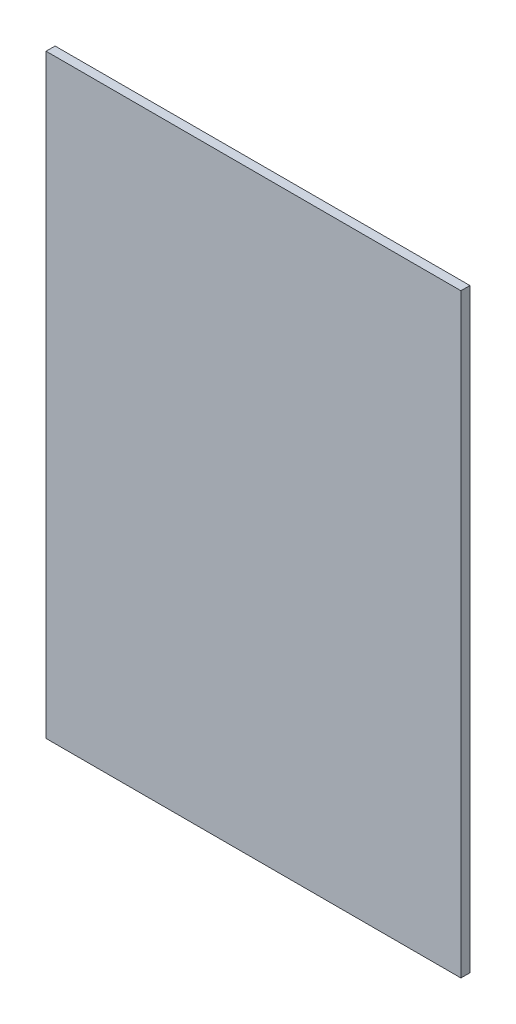
ISO-10303-21;
HEADER;
FILE_DESCRIPTION(('STEP AP214'),'2;1');
FILE_NAME('part.step','',(''),(''),'','','');
FILE_SCHEMA(('AUTOMOTIVE_DESIGN { 1 0 10303 214 1 1 1 1 }'));
ENDSEC;
DATA;
#1=APPLICATION_CONTEXT('core data for automotive mechanical design processes');
#2=APPLICATION_PROTOCOL_DEFINITION('international standard','automotive_design',2000,#1);
#3=PRODUCT_CONTEXT('',#1,'mechanical');
#4=PRODUCT('Part','Part','',(#3));
#5=PRODUCT_RELATED_PRODUCT_CATEGORY('part','',(#4));
#6=PRODUCT_DEFINITION_FORMATION('','',#4);
#7=PRODUCT_DEFINITION_CONTEXT('part definition',#1,'design');
#8=PRODUCT_DEFINITION('design','',#6,#7);
#9=PRODUCT_DEFINITION_SHAPE('','',#8);
#10=(LENGTH_UNIT() NAMED_UNIT(*) SI_UNIT(.MILLI.,.METRE.));
#11=(NAMED_UNIT(*) PLANE_ANGLE_UNIT() SI_UNIT($,.RADIAN.));
#12=(NAMED_UNIT(*) SI_UNIT($,.STERADIAN.) SOLID_ANGLE_UNIT());
#13=UNCERTAINTY_MEASURE_WITH_UNIT(LENGTH_MEASURE(1.E-05),#10,'distance_accuracy_value','');
#14=(GEOMETRIC_REPRESENTATION_CONTEXT(3) GLOBAL_UNCERTAINTY_ASSIGNED_CONTEXT((#13)) GLOBAL_UNIT_ASSIGNED_CONTEXT((#10,
#11,#12)) REPRESENTATION_CONTEXT('',''));
#15=CARTESIAN_POINT('',(0.,0.,0.));
#16=DIRECTION('',(0.,0.,1.));
#17=DIRECTION('',(1.,0.,0.));
#18=AXIS2_PLACEMENT_3D('',#15,#16,#17);
#19=CARTESIAN_POINT('',(-230.,-330.,10.));
#20=DIRECTION('',(1.,0.,0.));
#21=DIRECTION('',(0.,0.,-1.));
#22=AXIS2_PLACEMENT_3D('',#19,#20,#21);
#23=PLANE('',#22);
#24=DIRECTION('',(0.,-1.,0.));
#25=VECTOR('',#24,1.);
#26=CARTESIAN_POINT('',(-230.,-330.,0.));
#27=LINE('',#26,#25);
#28=CARTESIAN_POINT('',(-230.,330.,0.));
#29=VERTEX_POINT('',#28);
#30=CARTESIAN_POINT('',(-230.,-330.,0.));
#31=VERTEX_POINT('',#30);
#32=EDGE_CURVE('E129',#29,#31,#27,.T.);
#33=ORIENTED_EDGE('',*,*,#32,.T.);
#34=DIRECTION('',(0.,0.,-1.));
#35=VECTOR('',#34,1.);
#36=CARTESIAN_POINT('',(-230.,-330.,10.));
#37=LINE('',#36,#35);
#38=CARTESIAN_POINT('',(-230.,-330.,10.));
#39=VERTEX_POINT('',#38);
#40=EDGE_CURVE('E11',#39,#31,#37,.T.);
#41=ORIENTED_EDGE('',*,*,#40,.F.);
#42=DIRECTION('',(0.,-1.,0.));
#43=VECTOR('',#42,1.);
#44=CARTESIAN_POINT('',(-230.,-330.,10.));
#45=LINE('',#44,#43);
#46=CARTESIAN_POINT('',(-230.,330.,10.));
#47=VERTEX_POINT('',#46);
#48=EDGE_CURVE('E149',#47,#39,#45,.T.);
#49=ORIENTED_EDGE('',*,*,#48,.F.);
#50=DIRECTION('',(0.,0.,-1.));
#51=VECTOR('',#50,1.);
#52=CARTESIAN_POINT('',(-230.,330.,10.));
#53=LINE('',#52,#51);
#54=EDGE_CURVE('E154',#47,#29,#53,.T.);
#55=ORIENTED_EDGE('',*,*,#54,.T.);
#56=EDGE_LOOP('',(#33,#41,#49,#55));
#57=FACE_BOUND('',#56,.T.);
#58=ADVANCED_FACE('F33',(#57),#23,.F.);
#59=CARTESIAN_POINT('',(230.,-330.,10.));
#60=DIRECTION('',(0.,1.,0.));
#61=DIRECTION('',(0.,0.,1.));
#62=AXIS2_PLACEMENT_3D('',#59,#60,#61);
#63=PLANE('',#62);
#64=DIRECTION('',(1.,0.,0.));
#65=VECTOR('',#64,1.);
#66=CARTESIAN_POINT('',(230.,-330.,0.));
#67=LINE('',#66,#65);
#68=CARTESIAN_POINT('',(230.,-330.,0.));
#69=VERTEX_POINT('',#68);
#70=EDGE_CURVE('E133',#31,#69,#67,.T.);
#71=ORIENTED_EDGE('',*,*,#70,.T.);
#72=DIRECTION('',(0.,0.,-1.));
#73=VECTOR('',#72,1.);
#74=CARTESIAN_POINT('',(230.,-330.,10.));
#75=LINE('',#74,#73);
#76=CARTESIAN_POINT('',(230.,-330.,10.));
#77=VERTEX_POINT('',#76);
#78=EDGE_CURVE('E40',#77,#69,#75,.T.);
#79=ORIENTED_EDGE('',*,*,#78,.F.);
#80=DIRECTION('',(1.,0.,0.));
#81=VECTOR('',#80,1.);
#82=CARTESIAN_POINT('',(230.,-330.,10.));
#83=LINE('',#82,#81);
#84=EDGE_CURVE('E84',#39,#77,#83,.T.);
#85=ORIENTED_EDGE('',*,*,#84,.F.);
#86=ORIENTED_EDGE('',*,*,#40,.T.);
#87=EDGE_LOOP('',(#71,#79,#85,#86));
#88=FACE_BOUND('',#87,.T.);
#89=ADVANCED_FACE('F183',(#88),#63,.F.);
#90=CARTESIAN_POINT('',(230.,-330.,10.));
#91=DIRECTION('',(-1.,0.,0.));
#92=DIRECTION('',(0.,0.,1.));
#93=AXIS2_PLACEMENT_3D('',#90,#91,#92);
#94=PLANE('',#93);
#95=DIRECTION('',(0.,1.,0.));
#96=VECTOR('',#95,1.);
#97=CARTESIAN_POINT('',(230.,-330.,0.));
#98=LINE('',#97,#96);
#99=CARTESIAN_POINT('',(230.,330.,0.));
#100=VERTEX_POINT('',#99);
#101=EDGE_CURVE('E157',#69,#100,#98,.T.);
#102=ORIENTED_EDGE('',*,*,#101,.T.);
#103=DIRECTION('',(0.,0.,-1.));
#104=VECTOR('',#103,1.);
#105=CARTESIAN_POINT('',(230.,330.,10.));
#106=LINE('',#105,#104);
#107=CARTESIAN_POINT('',(230.,330.,10.));
#108=VERTEX_POINT('',#107);
#109=EDGE_CURVE('E161',#108,#100,#106,.T.);
#110=ORIENTED_EDGE('',*,*,#109,.F.);
#111=DIRECTION('',(0.,1.,0.));
#112=VECTOR('',#111,1.);
#113=CARTESIAN_POINT('',(230.,-330.,10.));
#114=LINE('',#113,#112);
#115=EDGE_CURVE('E152',#77,#108,#114,.T.);
#116=ORIENTED_EDGE('',*,*,#115,.F.);
#117=ORIENTED_EDGE('',*,*,#78,.T.);
#118=EDGE_LOOP('',(#102,#110,#116,#117));
#119=FACE_BOUND('',#118,.T.);
#120=ADVANCED_FACE('F166',(#119),#94,.F.);
#121=CARTESIAN_POINT('',(230.,330.,10.));
#122=DIRECTION('',(0.,-1.,0.));
#123=DIRECTION('',(0.,0.,-1.));
#124=AXIS2_PLACEMENT_3D('',#121,#122,#123);
#125=PLANE('',#124);
#126=DIRECTION('',(-1.,0.,0.));
#127=VECTOR('',#126,1.);
#128=CARTESIAN_POINT('',(230.,330.,0.));
#129=LINE('',#128,#127);
#130=EDGE_CURVE('E77',#100,#29,#129,.T.);
#131=ORIENTED_EDGE('',*,*,#130,.T.);
#132=ORIENTED_EDGE('',*,*,#54,.F.);
#133=DIRECTION('',(-1.,0.,0.));
#134=VECTOR('',#133,1.);
#135=CARTESIAN_POINT('',(230.,330.,10.));
#136=LINE('',#135,#134);
#137=EDGE_CURVE('E56',#108,#47,#136,.T.);
#138=ORIENTED_EDGE('',*,*,#137,.F.);
#139=ORIENTED_EDGE('',*,*,#109,.T.);
#140=EDGE_LOOP('',(#131,#132,#138,#139));
#141=FACE_BOUND('',#140,.T.);
#142=ADVANCED_FACE('F174',(#141),#125,.F.);
#143=CARTESIAN_POINT('',(0.,0.,10.));
#144=DIRECTION('',(0.,0.,1.));
#145=DIRECTION('',(1.,0.,0.));
#146=AXIS2_PLACEMENT_3D('',#143,#144,#145);
#147=PLANE('',#146);
#148=ORIENTED_EDGE('',*,*,#48,.T.);
#149=ORIENTED_EDGE('',*,*,#84,.T.);
#150=ORIENTED_EDGE('',*,*,#115,.T.);
#151=ORIENTED_EDGE('',*,*,#137,.T.);
#152=EDGE_LOOP('',(#148,#149,#150,#151));
#153=FACE_BOUND('',#152,.T.);
#154=ADVANCED_FACE('F176',(#153),#147,.T.);
#155=CARTESIAN_POINT('',(0.,0.,0.));
#156=DIRECTION('',(0.,0.,1.));
#157=DIRECTION('',(1.,0.,0.));
#158=AXIS2_PLACEMENT_3D('',#155,#156,#157);
#159=PLANE('',#158);
#160=DIRECTION('',(-1.,0.,0.));
#161=VECTOR('',#160,1.);
#162=CARTESIAN_POINT('',(230.,328.,0.));
#163=LINE('',#162,#161);
#164=CARTESIAN_POINT('',(228.,328.,0.));
#165=VERTEX_POINT('',#164);
#166=CARTESIAN_POINT('',(-228.,328.,0.));
#167=VERTEX_POINT('',#166);
#168=EDGE_CURVE('E124',#165,#167,#163,.T.);
#169=ORIENTED_EDGE('',*,*,#168,.T.);
#170=DIRECTION('',(0.,-1.,0.));
#171=VECTOR('',#170,1.);
#172=CARTESIAN_POINT('',(-228.,-330.,0.));
#173=LINE('',#172,#171);
#174=CARTESIAN_POINT('',(-228.,-328.,0.));
#175=VERTEX_POINT('',#174);
#176=EDGE_CURVE('E143',#167,#175,#173,.T.);
#177=ORIENTED_EDGE('',*,*,#176,.T.);
#178=DIRECTION('',(1.,0.,0.));
#179=VECTOR('',#178,1.);
#180=CARTESIAN_POINT('',(230.,-328.,0.));
#181=LINE('',#180,#179);
#182=CARTESIAN_POINT('',(228.,-328.,0.));
#183=VERTEX_POINT('',#182);
#184=EDGE_CURVE('E128',#175,#183,#181,.T.);
#185=ORIENTED_EDGE('',*,*,#184,.T.);
#186=DIRECTION('',(0.,1.,0.));
#187=VECTOR('',#186,1.);
#188=CARTESIAN_POINT('',(228.,-330.,0.));
#189=LINE('',#188,#187);
#190=EDGE_CURVE('E47',#183,#165,#189,.T.);
#191=ORIENTED_EDGE('',*,*,#190,.T.);
#192=EDGE_LOOP('',(#169,#177,#185,#191));
#193=FACE_BOUND('',#192,.T.);
#194=ORIENTED_EDGE('',*,*,#32,.F.);
#195=ORIENTED_EDGE('',*,*,#130,.F.);
#196=ORIENTED_EDGE('',*,*,#101,.F.);
#197=ORIENTED_EDGE('',*,*,#70,.F.);
#198=EDGE_LOOP('',(#194,#195,#196,#197));
#199=FACE_BOUND('',#198,.T.);
#200=ADVANCED_FACE('F170',(#193,#199),#159,.F.);
#201=CARTESIAN_POINT('',(-228.,-330.,10.));
#202=DIRECTION('',(1.,0.,0.));
#203=DIRECTION('',(0.,0.,-1.));
#204=AXIS2_PLACEMENT_3D('',#201,#202,#203);
#205=PLANE('',#204);
#206=ORIENTED_EDGE('',*,*,#176,.F.);
#207=DIRECTION('',(0.,0.,-1.));
#208=VECTOR('',#207,1.);
#209=CARTESIAN_POINT('',(-228.,328.,10.));
#210=LINE('',#209,#208);
#211=CARTESIAN_POINT('',(-228.,328.,8.));
#212=VERTEX_POINT('',#211);
#213=EDGE_CURVE('E123',#212,#167,#210,.T.);
#214=ORIENTED_EDGE('',*,*,#213,.F.);
#215=DIRECTION('',(0.,-1.,0.));
#216=VECTOR('',#215,1.);
#217=CARTESIAN_POINT('',(-228.,-330.,8.));
#218=LINE('',#217,#216);
#219=CARTESIAN_POINT('',(-228.,-328.,8.));
#220=VERTEX_POINT('',#219);
#221=EDGE_CURVE('E111',#212,#220,#218,.T.);
#222=ORIENTED_EDGE('',*,*,#221,.T.);
#223=DIRECTION('',(0.,0.,-1.));
#224=VECTOR('',#223,1.);
#225=CARTESIAN_POINT('',(-228.,-328.,10.));
#226=LINE('',#225,#224);
#227=EDGE_CURVE('E121',#220,#175,#226,.T.);
#228=ORIENTED_EDGE('',*,*,#227,.T.);
#229=EDGE_LOOP('',(#206,#214,#222,#228));
#230=FACE_BOUND('',#229,.T.);
#231=ADVANCED_FACE('F120',(#230),#205,.T.);
#232=CARTESIAN_POINT('',(230.,-328.,10.));
#233=DIRECTION('',(0.,1.,0.));
#234=DIRECTION('',(0.,0.,1.));
#235=AXIS2_PLACEMENT_3D('',#232,#233,#234);
#236=PLANE('',#235);
#237=ORIENTED_EDGE('',*,*,#184,.F.);
#238=ORIENTED_EDGE('',*,*,#227,.F.);
#239=DIRECTION('',(1.,0.,0.));
#240=VECTOR('',#239,1.);
#241=CARTESIAN_POINT('',(230.,-328.,8.));
#242=LINE('',#241,#240);
#243=CARTESIAN_POINT('',(228.,-328.,8.));
#244=VERTEX_POINT('',#243);
#245=EDGE_CURVE('E107',#220,#244,#242,.T.);
#246=ORIENTED_EDGE('',*,*,#245,.T.);
#247=DIRECTION('',(0.,0.,-1.));
#248=VECTOR('',#247,1.);
#249=CARTESIAN_POINT('',(228.,-328.,10.));
#250=LINE('',#249,#248);
#251=EDGE_CURVE('E130',#244,#183,#250,.T.);
#252=ORIENTED_EDGE('',*,*,#251,.T.);
#253=EDGE_LOOP('',(#237,#238,#246,#252));
#254=FACE_BOUND('',#253,.T.);
#255=ADVANCED_FACE('F126',(#254),#236,.T.);
#256=CARTESIAN_POINT('',(228.,-330.,10.));
#257=DIRECTION('',(-1.,0.,0.));
#258=DIRECTION('',(0.,0.,1.));
#259=AXIS2_PLACEMENT_3D('',#256,#257,#258);
#260=PLANE('',#259);
#261=ORIENTED_EDGE('',*,*,#190,.F.);
#262=ORIENTED_EDGE('',*,*,#251,.F.);
#263=DIRECTION('',(0.,1.,0.));
#264=VECTOR('',#263,1.);
#265=CARTESIAN_POINT('',(228.,-330.,8.));
#266=LINE('',#265,#264);
#267=CARTESIAN_POINT('',(228.,328.,8.));
#268=VERTEX_POINT('',#267);
#269=EDGE_CURVE('E112',#244,#268,#266,.T.);
#270=ORIENTED_EDGE('',*,*,#269,.T.);
#271=DIRECTION('',(0.,0.,-1.));
#272=VECTOR('',#271,1.);
#273=CARTESIAN_POINT('',(228.,328.,10.));
#274=LINE('',#273,#272);
#275=EDGE_CURVE('E135',#268,#165,#274,.T.);
#276=ORIENTED_EDGE('',*,*,#275,.T.);
#277=EDGE_LOOP('',(#261,#262,#270,#276));
#278=FACE_BOUND('',#277,.T.);
#279=ADVANCED_FACE('F231',(#278),#260,.T.);
#280=CARTESIAN_POINT('',(230.,328.,10.));
#281=DIRECTION('',(0.,-1.,0.));
#282=DIRECTION('',(0.,0.,-1.));
#283=AXIS2_PLACEMENT_3D('',#280,#281,#282);
#284=PLANE('',#283);
#285=ORIENTED_EDGE('',*,*,#168,.F.);
#286=ORIENTED_EDGE('',*,*,#275,.F.);
#287=DIRECTION('',(-1.,0.,0.));
#288=VECTOR('',#287,1.);
#289=CARTESIAN_POINT('',(230.,328.,8.));
#290=LINE('',#289,#288);
#291=EDGE_CURVE('E138',#268,#212,#290,.T.);
#292=ORIENTED_EDGE('',*,*,#291,.T.);
#293=ORIENTED_EDGE('',*,*,#213,.T.);
#294=EDGE_LOOP('',(#285,#286,#292,#293));
#295=FACE_BOUND('',#294,.T.);
#296=ADVANCED_FACE('F240',(#295),#284,.T.);
#297=CARTESIAN_POINT('',(0.,0.,8.));
#298=DIRECTION('',(0.,0.,1.));
#299=DIRECTION('',(1.,0.,0.));
#300=AXIS2_PLACEMENT_3D('',#297,#298,#299);
#301=PLANE('',#300);
#302=ORIENTED_EDGE('',*,*,#221,.F.);
#303=ORIENTED_EDGE('',*,*,#291,.F.);
#304=ORIENTED_EDGE('',*,*,#269,.F.);
#305=ORIENTED_EDGE('',*,*,#245,.F.);
#306=EDGE_LOOP('',(#302,#303,#304,#305));
#307=FACE_BOUND('',#306,.T.);
#308=ADVANCED_FACE('F109',(#307),#301,.F.);
#309=CLOSED_SHELL('',(#58,#89,#120,#142,#154,#200,#231,#255,#279,#296,#308));
#310=MANIFOLD_SOLID_BREP('B2',#309);
#311=ADVANCED_BREP_SHAPE_REPRESENTATION('',(#18,#310),#14);
#312=SHAPE_DEFINITION_REPRESENTATION(#9,#311);
ENDSEC;
END-ISO-10303-21;
